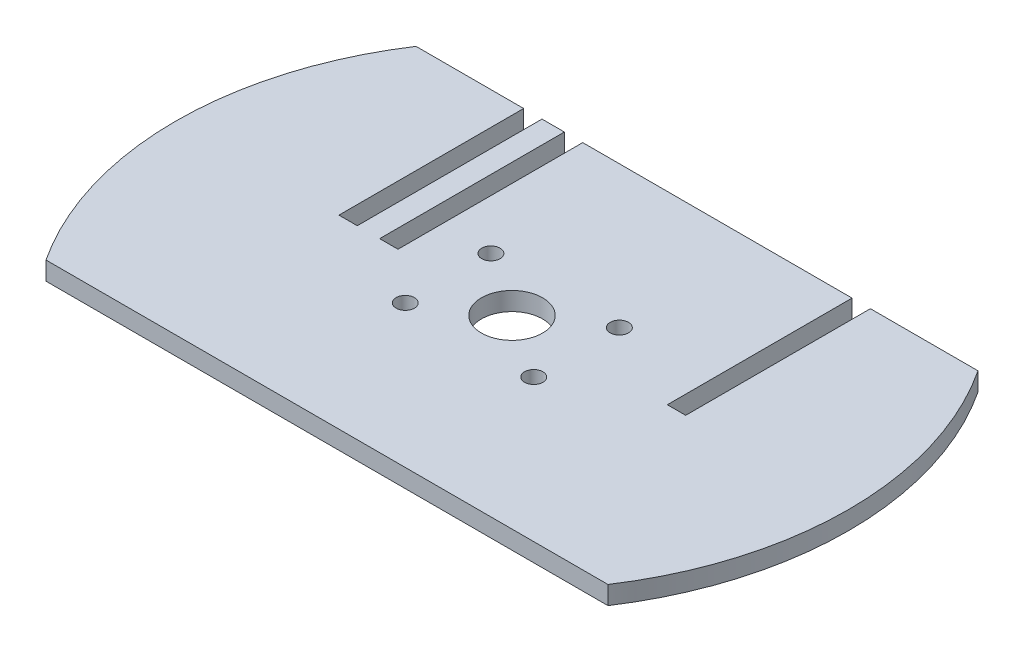
ISO-10303-21;
HEADER;
FILE_DESCRIPTION(('STEP AP214'),'2;1');
FILE_NAME('part.step','',(''),(''),'','','');
FILE_SCHEMA(('AUTOMOTIVE_DESIGN { 1 0 10303 214 1 1 1 1 }'));
ENDSEC;
DATA;
#1=APPLICATION_CONTEXT('core data for automotive mechanical design processes');
#2=APPLICATION_PROTOCOL_DEFINITION('international standard','automotive_design',2000,#1);
#3=PRODUCT_CONTEXT('',#1,'mechanical');
#4=PRODUCT('Part','Part','',(#3));
#5=PRODUCT_RELATED_PRODUCT_CATEGORY('part','',(#4));
#6=PRODUCT_DEFINITION_FORMATION('','',#4);
#7=PRODUCT_DEFINITION_CONTEXT('part definition',#1,'design');
#8=PRODUCT_DEFINITION('design','',#6,#7);
#9=PRODUCT_DEFINITION_SHAPE('','',#8);
#10=(LENGTH_UNIT() NAMED_UNIT(*) SI_UNIT(.MILLI.,.METRE.));
#11=(NAMED_UNIT(*) PLANE_ANGLE_UNIT() SI_UNIT($,.RADIAN.));
#12=(NAMED_UNIT(*) SI_UNIT($,.STERADIAN.) SOLID_ANGLE_UNIT());
#13=UNCERTAINTY_MEASURE_WITH_UNIT(LENGTH_MEASURE(1.E-05),#10,'distance_accuracy_value','');
#14=(GEOMETRIC_REPRESENTATION_CONTEXT(3) GLOBAL_UNCERTAINTY_ASSIGNED_CONTEXT((#13)) GLOBAL_UNIT_ASSIGNED_CONTEXT((#10,
#11,#12)) REPRESENTATION_CONTEXT('',''));
#15=CARTESIAN_POINT('',(0.,0.,0.));
#16=DIRECTION('',(0.,0.,1.));
#17=DIRECTION('',(1.,0.,0.));
#18=AXIS2_PLACEMENT_3D('',#15,#16,#17);
#19=CARTESIAN_POINT('',(-12.45236018043,3.,-3.70299422628653));
#20=DIRECTION('',(0.,0.,-1.));
#21=DIRECTION('',(-1.,0.,0.));
#22=AXIS2_PLACEMENT_3D('',#19,#20,#21);
#23=PLANE('',#22);
#24=DIRECTION('',(0.,1.,0.));
#25=VECTOR('',#24,1.);
#26=CARTESIAN_POINT('',(-15.45236018043,0.,-3.70299422628653));
#27=LINE('',#26,#25);
#28=CARTESIAN_POINT('',(-15.45236018043,0.,-3.70299422628653));
#29=VERTEX_POINT('',#28);
#30=CARTESIAN_POINT('',(-15.45236018043,3.,-3.70299422628653));
#31=VERTEX_POINT('',#30);
#32=EDGE_CURVE('E199',#29,#31,#27,.T.);
#33=ORIENTED_EDGE('',*,*,#32,.F.);
#34=DIRECTION('',(1.,0.,0.));
#35=VECTOR('',#34,1.);
#36=CARTESIAN_POINT('',(-12.45236018043,0.,-3.70299422628653));
#37=LINE('',#36,#35);
#38=CARTESIAN_POINT('',(-19.11236018043,0.,-3.70299422628653));
#39=VERTEX_POINT('',#38);
#40=EDGE_CURVE('E329',#39,#29,#37,.T.);
#41=ORIENTED_EDGE('',*,*,#40,.F.);
#42=DIRECTION('',(0.,-1.,0.));
#43=VECTOR('',#42,1.);
#44=CARTESIAN_POINT('',(-19.11236018043,3.,-3.70299422628653));
#45=LINE('',#44,#43);
#46=CARTESIAN_POINT('',(-19.11236018043,3.,-3.70299422628653));
#47=VERTEX_POINT('',#46);
#48=EDGE_CURVE('E356',#47,#39,#45,.T.);
#49=ORIENTED_EDGE('',*,*,#48,.F.);
#50=DIRECTION('',(1.,0.,0.));
#51=VECTOR('',#50,1.);
#52=CARTESIAN_POINT('',(-19.11236018043,3.,-3.70299422628653));
#53=LINE('',#52,#51);
#54=EDGE_CURVE('E290',#47,#31,#53,.T.);
#55=ORIENTED_EDGE('',*,*,#54,.T.);
#56=EDGE_LOOP('',(#33,#41,#49,#55));
#57=FACE_BOUND('',#56,.T.);
#58=ADVANCED_FACE('F45',(#57),#23,.T.);
#59=CARTESIAN_POINT('',(54.57763981957,3.,56.7970057737135));
#60=DIRECTION('',(0.,0.,1.));
#61=DIRECTION('',(1.,0.,0.));
#62=AXIS2_PLACEMENT_3D('',#59,#60,#61);
#63=PLANE('',#62);
#64=DIRECTION('',(0.,1.,0.));
#65=VECTOR('',#64,1.);
#66=CARTESIAN_POINT('',(-39.7014161737776,0.,56.7970057737135));
#67=LINE('',#66,#65);
#68=CARTESIAN_POINT('',(-39.7014161737776,0.,56.7970057737135));
#69=VERTEX_POINT('',#68);
#70=CARTESIAN_POINT('',(-39.7014161737776,3.,56.7970057737135));
#71=VERTEX_POINT('',#70);
#72=EDGE_CURVE('E211',#69,#71,#67,.T.);
#73=ORIENTED_EDGE('',*,*,#72,.F.);
#74=DIRECTION('',(-1.,0.,0.));
#75=VECTOR('',#74,1.);
#76=CARTESIAN_POINT('',(54.57763981957,0.,56.7970057737135));
#77=LINE('',#76,#75);
#78=CARTESIAN_POINT('',(52.1666958129177,0.,56.7970057737135));
#79=VERTEX_POINT('',#78);
#80=EDGE_CURVE('E265',#79,#69,#77,.T.);
#81=ORIENTED_EDGE('',*,*,#80,.F.);
#82=DIRECTION('',(0.,1.,0.));
#83=VECTOR('',#82,1.);
#84=CARTESIAN_POINT('',(52.1666958129177,0.,56.7970057737135));
#85=LINE('',#84,#83);
#86=CARTESIAN_POINT('',(52.1666958129177,3.,56.7970057737135));
#87=VERTEX_POINT('',#86);
#88=EDGE_CURVE('E217',#79,#87,#85,.T.);
#89=ORIENTED_EDGE('',*,*,#88,.T.);
#90=DIRECTION('',(-1.,0.,0.));
#91=VECTOR('',#90,1.);
#92=CARTESIAN_POINT('',(54.57763981957,3.,56.7970057737135));
#93=LINE('',#92,#91);
#94=EDGE_CURVE('E269',#87,#71,#93,.T.);
#95=ORIENTED_EDGE('',*,*,#94,.T.);
#96=EDGE_LOOP('',(#73,#81,#89,#95));
#97=FACE_BOUND('',#96,.T.);
#98=ADVANCED_FACE('F47',(#97),#63,.T.);
#99=CARTESIAN_POINT('',(34.57763981957,3.,-3.70299422628653));
#100=DIRECTION('',(0.,0.,-1.));
#101=DIRECTION('',(-1.,0.,0.));
#102=AXIS2_PLACEMENT_3D('',#99,#100,#101);
#103=PLANE('',#102);
#104=DIRECTION('',(0.,1.,0.));
#105=VECTOR('',#104,1.);
#106=CARTESIAN_POINT('',(52.1666958129177,0.,-3.70299422628653));
#107=LINE('',#106,#105);
#108=CARTESIAN_POINT('',(52.1666958129177,0.,-3.70299422628653));
#109=VERTEX_POINT('',#108);
#110=CARTESIAN_POINT('',(52.1666958129177,3.,-3.70299422628653));
#111=VERTEX_POINT('',#110);
#112=EDGE_CURVE('E198',#109,#111,#107,.T.);
#113=ORIENTED_EDGE('',*,*,#112,.F.);
#114=DIRECTION('',(1.,0.,0.));
#115=VECTOR('',#114,1.);
#116=CARTESIAN_POINT('',(34.57763981957,0.,-3.70299422628653));
#117=LINE('',#116,#115);
#118=CARTESIAN_POINT('',(34.57763981957,0.,-3.70299422628653));
#119=VERTEX_POINT('',#118);
#120=EDGE_CURVE('E274',#119,#109,#117,.T.);
#121=ORIENTED_EDGE('',*,*,#120,.F.);
#122=DIRECTION('',(0.,-1.,0.));
#123=VECTOR('',#122,1.);
#124=CARTESIAN_POINT('',(34.57763981957,3.,-3.70299422628653));
#125=LINE('',#124,#123);
#126=CARTESIAN_POINT('',(34.57763981957,3.,-3.70299422628653));
#127=VERTEX_POINT('',#126);
#128=EDGE_CURVE('E11',#127,#119,#125,.T.);
#129=ORIENTED_EDGE('',*,*,#128,.F.);
#130=DIRECTION('',(1.,0.,0.));
#131=VECTOR('',#130,1.);
#132=CARTESIAN_POINT('',(34.57763981957,3.,-3.70299422628653));
#133=LINE('',#132,#131);
#134=EDGE_CURVE('E306',#127,#111,#133,.T.);
#135=ORIENTED_EDGE('',*,*,#134,.T.);
#136=EDGE_LOOP('',(#113,#121,#129,#135));
#137=FACE_BOUND('',#136,.T.);
#138=ADVANCED_FACE('F420',(#137),#103,.T.);
#139=CARTESIAN_POINT('',(34.57763981957,3.,26.4970057737135));
#140=DIRECTION('',(-1.,0.,0.));
#141=DIRECTION('',(0.,0.,1.));
#142=AXIS2_PLACEMENT_3D('',#139,#140,#141);
#143=PLANE('',#142);
#144=DIRECTION('',(0.,0.,-1.));
#145=VECTOR('',#144,1.);
#146=CARTESIAN_POINT('',(34.57763981957,0.,26.4970057737135));
#147=LINE('',#146,#145);
#148=CARTESIAN_POINT('',(34.57763981957,0.,26.4970057737135));
#149=VERTEX_POINT('',#148);
#150=EDGE_CURVE('E340',#149,#119,#147,.T.);
#151=ORIENTED_EDGE('',*,*,#150,.F.);
#152=DIRECTION('',(0.,-1.,0.));
#153=VECTOR('',#152,1.);
#154=CARTESIAN_POINT('',(34.57763981957,3.,26.4970057737135));
#155=LINE('',#154,#153);
#156=CARTESIAN_POINT('',(34.57763981957,3.,26.4970057737135));
#157=VERTEX_POINT('',#156);
#158=EDGE_CURVE('E55',#157,#149,#155,.T.);
#159=ORIENTED_EDGE('',*,*,#158,.F.);
#160=DIRECTION('',(0.,0.,-1.));
#161=VECTOR('',#160,1.);
#162=CARTESIAN_POINT('',(34.57763981957,3.,26.4970057737135));
#163=LINE('',#162,#161);
#164=EDGE_CURVE('E302',#157,#127,#163,.T.);
#165=ORIENTED_EDGE('',*,*,#164,.T.);
#166=ORIENTED_EDGE('',*,*,#128,.T.);
#167=EDGE_LOOP('',(#151,#159,#165,#166));
#168=FACE_BOUND('',#167,.T.);
#169=ADVANCED_FACE('F416',(#168),#143,.T.);
#170=CARTESIAN_POINT('',(31.57763981957,3.,26.4970057737135));
#171=DIRECTION('',(0.,0.,-1.));
#172=DIRECTION('',(-1.,0.,0.));
#173=AXIS2_PLACEMENT_3D('',#170,#171,#172);
#174=PLANE('',#173);
#175=DIRECTION('',(1.,0.,0.));
#176=VECTOR('',#175,1.);
#177=CARTESIAN_POINT('',(31.57763981957,0.,26.4970057737135));
#178=LINE('',#177,#176);
#179=CARTESIAN_POINT('',(31.57763981957,0.,26.4970057737135));
#180=VERTEX_POINT('',#179);
#181=EDGE_CURVE('E336',#180,#149,#178,.T.);
#182=ORIENTED_EDGE('',*,*,#181,.F.);
#183=DIRECTION('',(0.,-1.,0.));
#184=VECTOR('',#183,1.);
#185=CARTESIAN_POINT('',(31.57763981957,3.,26.4970057737135));
#186=LINE('',#185,#184);
#187=CARTESIAN_POINT('',(31.57763981957,3.,26.4970057737135));
#188=VERTEX_POINT('',#187);
#189=EDGE_CURVE('E349',#188,#180,#186,.T.);
#190=ORIENTED_EDGE('',*,*,#189,.F.);
#191=DIRECTION('',(1.,0.,0.));
#192=VECTOR('',#191,1.);
#193=CARTESIAN_POINT('',(31.57763981957,3.,26.4970057737135));
#194=LINE('',#193,#192);
#195=EDGE_CURVE('E298',#188,#157,#194,.T.);
#196=ORIENTED_EDGE('',*,*,#195,.T.);
#197=ORIENTED_EDGE('',*,*,#158,.T.);
#198=EDGE_LOOP('',(#182,#190,#196,#197));
#199=FACE_BOUND('',#198,.T.);
#200=ADVANCED_FACE('F412',(#199),#174,.T.);
#201=CARTESIAN_POINT('',(31.57763981957,3.,-3.70299422628653));
#202=DIRECTION('',(1.,0.,0.));
#203=DIRECTION('',(0.,0.,-1.));
#204=AXIS2_PLACEMENT_3D('',#201,#202,#203);
#205=PLANE('',#204);
#206=DIRECTION('',(0.,0.,1.));
#207=VECTOR('',#206,1.);
#208=CARTESIAN_POINT('',(31.57763981957,0.,-3.70299422628653));
#209=LINE('',#208,#207);
#210=CARTESIAN_POINT('',(31.57763981957,0.,-3.70299422628653));
#211=VERTEX_POINT('',#210);
#212=EDGE_CURVE('E332',#211,#180,#209,.T.);
#213=ORIENTED_EDGE('',*,*,#212,.F.);
#214=DIRECTION('',(0.,-1.,0.));
#215=VECTOR('',#214,1.);
#216=CARTESIAN_POINT('',(31.57763981957,3.,-3.70299422628653));
#217=LINE('',#216,#215);
#218=CARTESIAN_POINT('',(31.57763981957,3.,-3.70299422628653));
#219=VERTEX_POINT('',#218);
#220=EDGE_CURVE('E352',#219,#211,#217,.T.);
#221=ORIENTED_EDGE('',*,*,#220,.F.);
#222=DIRECTION('',(0.,0.,1.));
#223=VECTOR('',#222,1.);
#224=CARTESIAN_POINT('',(31.57763981957,3.,-3.70299422628653));
#225=LINE('',#224,#223);
#226=EDGE_CURVE('E294',#219,#188,#225,.T.);
#227=ORIENTED_EDGE('',*,*,#226,.T.);
#228=ORIENTED_EDGE('',*,*,#189,.T.);
#229=EDGE_LOOP('',(#213,#221,#227,#228));
#230=FACE_BOUND('',#229,.T.);
#231=ADVANCED_FACE('F409',(#230),#205,.T.);
#232=DIRECTION('',(0.,1.,0.));
#233=VECTOR('',#232,1.);
#234=CARTESIAN_POINT('',(-12.45236018043,0.,-3.70299422628653));
#235=LINE('',#234,#233);
#236=CARTESIAN_POINT('',(-12.45236018043,0.,-3.70299422628653));
#237=VERTEX_POINT('',#236);
#238=CARTESIAN_POINT('',(-12.45236018043,3.,-3.70299422628653));
#239=VERTEX_POINT('',#238);
#240=EDGE_CURVE('E63',#237,#239,#235,.T.);
#241=ORIENTED_EDGE('',*,*,#240,.T.);
#242=EDGE_CURVE('E289',#239,#219,#53,.T.);
#243=ORIENTED_EDGE('',*,*,#242,.T.);
#244=ORIENTED_EDGE('',*,*,#220,.T.);
#245=EDGE_CURVE('E328',#237,#211,#37,.T.);
#246=ORIENTED_EDGE('',*,*,#245,.F.);
#247=EDGE_LOOP('',(#241,#243,#244,#246));
#248=FACE_BOUND('',#247,.T.);
#249=ADVANCED_FACE('F402',(#248),#23,.T.);
#250=CARTESIAN_POINT('',(-19.11236018043,3.,26.4970057737135));
#251=DIRECTION('',(-1.,0.,0.));
#252=DIRECTION('',(0.,0.,1.));
#253=AXIS2_PLACEMENT_3D('',#250,#251,#252);
#254=PLANE('',#253);
#255=DIRECTION('',(0.,0.,-1.));
#256=VECTOR('',#255,1.);
#257=CARTESIAN_POINT('',(-19.11236018043,0.,26.4970057737135));
#258=LINE('',#257,#256);
#259=CARTESIAN_POINT('',(-19.11236018043,0.,26.4970057737135));
#260=VERTEX_POINT('',#259);
#261=EDGE_CURVE('E324',#260,#39,#258,.T.);
#262=ORIENTED_EDGE('',*,*,#261,.F.);
#263=DIRECTION('',(0.,-1.,0.));
#264=VECTOR('',#263,1.);
#265=CARTESIAN_POINT('',(-19.11236018043,3.,26.4970057737135));
#266=LINE('',#265,#264);
#267=CARTESIAN_POINT('',(-19.11236018043,3.,26.4970057737135));
#268=VERTEX_POINT('',#267);
#269=EDGE_CURVE('E360',#268,#260,#266,.T.);
#270=ORIENTED_EDGE('',*,*,#269,.F.);
#271=DIRECTION('',(0.,0.,-1.));
#272=VECTOR('',#271,1.);
#273=CARTESIAN_POINT('',(-19.11236018043,3.,26.4970057737135));
#274=LINE('',#273,#272);
#275=EDGE_CURVE('E285',#268,#47,#274,.T.);
#276=ORIENTED_EDGE('',*,*,#275,.T.);
#277=ORIENTED_EDGE('',*,*,#48,.T.);
#278=EDGE_LOOP('',(#262,#270,#276,#277));
#279=FACE_BOUND('',#278,.T.);
#280=ADVANCED_FACE('F393',(#279),#254,.T.);
#281=CARTESIAN_POINT('',(-22.11236018043,3.,26.4970057737135));
#282=DIRECTION('',(0.,0.,-1.));
#283=DIRECTION('',(-1.,0.,0.));
#284=AXIS2_PLACEMENT_3D('',#281,#282,#283);
#285=PLANE('',#284);
#286=DIRECTION('',(1.,0.,0.));
#287=VECTOR('',#286,1.);
#288=CARTESIAN_POINT('',(-22.11236018043,0.,26.4970057737135));
#289=LINE('',#288,#287);
#290=CARTESIAN_POINT('',(-22.11236018043,0.,26.4970057737135));
#291=VERTEX_POINT('',#290);
#292=EDGE_CURVE('E320',#291,#260,#289,.T.);
#293=ORIENTED_EDGE('',*,*,#292,.F.);
#294=DIRECTION('',(0.,-1.,0.));
#295=VECTOR('',#294,1.);
#296=CARTESIAN_POINT('',(-22.11236018043,3.,26.4970057737135));
#297=LINE('',#296,#295);
#298=CARTESIAN_POINT('',(-22.11236018043,3.,26.4970057737135));
#299=VERTEX_POINT('',#298);
#300=EDGE_CURVE('E362',#299,#291,#297,.T.);
#301=ORIENTED_EDGE('',*,*,#300,.F.);
#302=DIRECTION('',(1.,0.,0.));
#303=VECTOR('',#302,1.);
#304=CARTESIAN_POINT('',(-22.11236018043,3.,26.4970057737135));
#305=LINE('',#304,#303);
#306=EDGE_CURVE('E281',#299,#268,#305,.T.);
#307=ORIENTED_EDGE('',*,*,#306,.T.);
#308=ORIENTED_EDGE('',*,*,#269,.T.);
#309=EDGE_LOOP('',(#293,#301,#307,#308));
#310=FACE_BOUND('',#309,.T.);
#311=ADVANCED_FACE('F390',(#310),#285,.T.);
#312=CARTESIAN_POINT('',(-22.11236018043,3.,-3.70299422628653));
#313=DIRECTION('',(1.,0.,0.));
#314=DIRECTION('',(0.,0.,-1.));
#315=AXIS2_PLACEMENT_3D('',#312,#313,#314);
#316=PLANE('',#315);
#317=DIRECTION('',(0.,0.,1.));
#318=VECTOR('',#317,1.);
#319=CARTESIAN_POINT('',(-22.11236018043,0.,-3.70299422628653));
#320=LINE('',#319,#318);
#321=CARTESIAN_POINT('',(-22.11236018043,0.,-3.70299422628653));
#322=VERTEX_POINT('',#321);
#323=EDGE_CURVE('E316',#322,#291,#320,.T.);
#324=ORIENTED_EDGE('',*,*,#323,.F.);
#325=DIRECTION('',(0.,-1.,0.));
#326=VECTOR('',#325,1.);
#327=CARTESIAN_POINT('',(-22.11236018043,3.,-3.70299422628653));
#328=LINE('',#327,#326);
#329=CARTESIAN_POINT('',(-22.11236018043,3.,-3.70299422628653));
#330=VERTEX_POINT('',#329);
#331=EDGE_CURVE('E49',#330,#322,#328,.T.);
#332=ORIENTED_EDGE('',*,*,#331,.F.);
#333=DIRECTION('',(0.,0.,1.));
#334=VECTOR('',#333,1.);
#335=CARTESIAN_POINT('',(-22.11236018043,3.,-3.70299422628653));
#336=LINE('',#335,#334);
#337=EDGE_CURVE('E277',#330,#299,#336,.T.);
#338=ORIENTED_EDGE('',*,*,#337,.T.);
#339=ORIENTED_EDGE('',*,*,#300,.T.);
#340=EDGE_LOOP('',(#324,#332,#338,#339));
#341=FACE_BOUND('',#340,.T.);
#342=ADVANCED_FACE('F375',(#341),#316,.T.);
#343=CARTESIAN_POINT('',(-42.11236018043,3.,-3.70299422628653));
#344=DIRECTION('',(0.,0.,-1.));
#345=DIRECTION('',(-1.,0.,0.));
#346=AXIS2_PLACEMENT_3D('',#343,#344,#345);
#347=PLANE('',#346);
#348=DIRECTION('',(0.,1.,0.));
#349=VECTOR('',#348,1.);
#350=CARTESIAN_POINT('',(-39.7014161737776,0.,-3.70299422628653));
#351=LINE('',#350,#349);
#352=CARTESIAN_POINT('',(-39.7014161737776,0.,-3.70299422628653));
#353=VERTEX_POINT('',#352);
#354=CARTESIAN_POINT('',(-39.7014161737776,3.,-3.70299422628653));
#355=VERTEX_POINT('',#354);
#356=EDGE_CURVE('E71',#353,#355,#351,.T.);
#357=ORIENTED_EDGE('',*,*,#356,.T.);
#358=DIRECTION('',(1.,0.,0.));
#359=VECTOR('',#358,1.);
#360=CARTESIAN_POINT('',(-42.11236018043,3.,-3.70299422628653));
#361=LINE('',#360,#359);
#362=EDGE_CURVE('E273',#355,#330,#361,.T.);
#363=ORIENTED_EDGE('',*,*,#362,.T.);
#364=ORIENTED_EDGE('',*,*,#331,.T.);
#365=DIRECTION('',(1.,0.,0.));
#366=VECTOR('',#365,1.);
#367=CARTESIAN_POINT('',(-42.11236018043,0.,-3.70299422628653));
#368=LINE('',#367,#366);
#369=EDGE_CURVE('E313',#353,#322,#368,.T.);
#370=ORIENTED_EDGE('',*,*,#369,.F.);
#371=EDGE_LOOP('',(#357,#363,#364,#370));
#372=FACE_BOUND('',#371,.T.);
#373=ADVANCED_FACE('F372',(#372),#347,.T.);
#374=CARTESIAN_POINT('',(-42.11236018043,3.,46.7970057737135));
#375=DIRECTION('',(0.,-1.,0.));
#376=DIRECTION('',(0.,0.,-1.));
#377=AXIS2_PLACEMENT_3D('',#374,#375,#376);
#378=PLANE('',#377);
#379=CARTESIAN_POINT('',(-4.26736018042996,3.,33.4970057737135));
#380=DIRECTION('',(0.,1.,0.));
#381=DIRECTION('',(0.,0.,1.));
#382=AXIS2_PLACEMENT_3D('',#379,#380,#381);
#383=CIRCLE('',#382,1.5);
#384=CARTESIAN_POINT('',(-4.26736018042996,3.,34.9970057737135));
#385=VERTEX_POINT('',#384);
#386=EDGE_CURVE('E237',#385,#385,#383,.T.);
#387=ORIENTED_EDGE('',*,*,#386,.F.);
#388=EDGE_LOOP('',(#387));
#389=FACE_BOUND('',#388,.T.);
#390=CARTESIAN_POINT('',(16.73263981957,3.,19.4970057737135));
#391=DIRECTION('',(0.,1.,0.));
#392=DIRECTION('',(0.,0.,1.));
#393=AXIS2_PLACEMENT_3D('',#390,#391,#392);
#394=CIRCLE('',#393,1.5);
#395=CARTESIAN_POINT('',(16.73263981957,3.,20.9970057737135));
#396=VERTEX_POINT('',#395);
#397=EDGE_CURVE('E246',#396,#396,#394,.T.);
#398=ORIENTED_EDGE('',*,*,#397,.F.);
#399=EDGE_LOOP('',(#398));
#400=FACE_BOUND('',#399,.T.);
#401=CARTESIAN_POINT('',(16.73263981957,3.,33.4970057737135));
#402=DIRECTION('',(0.,1.,0.));
#403=DIRECTION('',(0.,0.,1.));
#404=AXIS2_PLACEMENT_3D('',#401,#402,#403);
#405=CIRCLE('',#404,1.5);
#406=CARTESIAN_POINT('',(16.73263981957,3.,34.9970057737135));
#407=VERTEX_POINT('',#406);
#408=EDGE_CURVE('E229',#407,#407,#405,.T.);
#409=ORIENTED_EDGE('',*,*,#408,.F.);
#410=EDGE_LOOP('',(#409));
#411=FACE_BOUND('',#410,.T.);
#412=CARTESIAN_POINT('',(-4.26736018042996,3.,19.4970057737135));
#413=DIRECTION('',(0.,1.,0.));
#414=DIRECTION('',(0.,0.,1.));
#415=AXIS2_PLACEMENT_3D('',#412,#413,#414);
#416=CIRCLE('',#415,1.5);
#417=CARTESIAN_POINT('',(-4.26736018042996,3.,20.9970057737135));
#418=VERTEX_POINT('',#417);
#419=EDGE_CURVE('E241',#418,#418,#416,.T.);
#420=ORIENTED_EDGE('',*,*,#419,.F.);
#421=EDGE_LOOP('',(#420));
#422=FACE_BOUND('',#421,.T.);
#423=CARTESIAN_POINT('',(6.23263981957004,3.,26.5470057737135));
#424=DIRECTION('',(0.,1.,0.));
#425=DIRECTION('',(0.,0.,1.));
#426=AXIS2_PLACEMENT_3D('',#423,#424,#425);
#427=CIRCLE('',#426,5.);
#428=CARTESIAN_POINT('',(6.23263981957004,3.,31.5470057737135));
#429=VERTEX_POINT('',#428);
#430=EDGE_CURVE('E257',#429,#429,#427,.T.);
#431=ORIENTED_EDGE('',*,*,#430,.F.);
#432=EDGE_LOOP('',(#431));
#433=FACE_BOUND('',#432,.T.);
#434=DIRECTION('',(1.,0.,0.));
#435=VECTOR('',#434,1.);
#436=CARTESIAN_POINT('',(-12.45236018043,3.,26.4970057737135));
#437=LINE('',#436,#435);
#438=CARTESIAN_POINT('',(-15.45236018043,3.,26.4970057737135));
#439=VERTEX_POINT('',#438);
#440=CARTESIAN_POINT('',(-12.45236018043,3.,26.4970057737135));
#441=VERTEX_POINT('',#440);
#442=EDGE_CURVE('E167',#439,#441,#437,.T.);
#443=ORIENTED_EDGE('',*,*,#442,.F.);
#444=DIRECTION('',(0.,0.,1.));
#445=VECTOR('',#444,1.);
#446=CARTESIAN_POINT('',(-15.45236018043,3.,26.4970057737135));
#447=LINE('',#446,#445);
#448=EDGE_CURVE('E182',#31,#439,#447,.T.);
#449=ORIENTED_EDGE('',*,*,#448,.F.);
#450=ORIENTED_EDGE('',*,*,#54,.F.);
#451=ORIENTED_EDGE('',*,*,#275,.F.);
#452=ORIENTED_EDGE('',*,*,#306,.F.);
#453=ORIENTED_EDGE('',*,*,#337,.F.);
#454=ORIENTED_EDGE('',*,*,#362,.F.);
#455=CARTESIAN_POINT('',(6.23263981957004,3.,26.5470057737135));
#456=DIRECTION('',(0.,-1.,0.));
#457=DIRECTION('',(0.,0.,-1.));
#458=AXIS2_PLACEMENT_3D('',#455,#456,#457);
#459=CIRCLE('',#458,55.);
#460=EDGE_CURVE('E207',#71,#355,#459,.T.);
#461=ORIENTED_EDGE('',*,*,#460,.F.);
#462=ORIENTED_EDGE('',*,*,#94,.F.);
#463=CARTESIAN_POINT('',(6.23263981957004,3.,26.5470057737135));
#464=DIRECTION('',(0.,-1.,0.));
#465=DIRECTION('',(0.,0.,-1.));
#466=AXIS2_PLACEMENT_3D('',#463,#464,#465);
#467=CIRCLE('',#466,55.);
#468=EDGE_CURVE('E210',#111,#87,#467,.T.);
#469=ORIENTED_EDGE('',*,*,#468,.F.);
#470=ORIENTED_EDGE('',*,*,#134,.F.);
#471=ORIENTED_EDGE('',*,*,#164,.F.);
#472=ORIENTED_EDGE('',*,*,#195,.F.);
#473=ORIENTED_EDGE('',*,*,#226,.F.);
#474=ORIENTED_EDGE('',*,*,#242,.F.);
#475=DIRECTION('',(0.,0.,-1.));
#476=VECTOR('',#475,1.);
#477=CARTESIAN_POINT('',(-12.45236018043,3.,-3.70299422628653));
#478=LINE('',#477,#476);
#479=EDGE_CURVE('E186',#441,#239,#478,.T.);
#480=ORIENTED_EDGE('',*,*,#479,.F.);
#481=EDGE_LOOP('',(#443,#449,#450,#451,#452,#453,#454,#461,#462,#469,#470,#471,#472,#473,#474,#480));
#482=FACE_BOUND('',#481,.T.);
#483=ADVANCED_FACE('F384',(#389,#400,#411,#422,#433,#482),#378,.F.);
#484=CARTESIAN_POINT('',(-42.11236018043,0.,46.7970057737135));
#485=DIRECTION('',(0.,-1.,0.));
#486=DIRECTION('',(0.,0.,-1.));
#487=AXIS2_PLACEMENT_3D('',#484,#485,#486);
#488=PLANE('',#487);
#489=DIRECTION('',(0.,0.,1.));
#490=VECTOR('',#489,1.);
#491=CARTESIAN_POINT('',(-15.45236018043,0.,26.4970057737135));
#492=LINE('',#491,#490);
#493=CARTESIAN_POINT('',(-15.45236018043,0.,26.4970057737135));
#494=VERTEX_POINT('',#493);
#495=EDGE_CURVE('E170',#29,#494,#492,.T.);
#496=ORIENTED_EDGE('',*,*,#495,.T.);
#497=DIRECTION('',(1.,0.,0.));
#498=VECTOR('',#497,1.);
#499=CARTESIAN_POINT('',(-12.45236018043,0.,26.4970057737135));
#500=LINE('',#499,#498);
#501=CARTESIAN_POINT('',(-12.45236018043,0.,26.4970057737135));
#502=VERTEX_POINT('',#501);
#503=EDGE_CURVE('E164',#494,#502,#500,.T.);
#504=ORIENTED_EDGE('',*,*,#503,.T.);
#505=DIRECTION('',(0.,0.,-1.));
#506=VECTOR('',#505,1.);
#507=CARTESIAN_POINT('',(-12.45236018043,0.,-3.70299422628653));
#508=LINE('',#507,#506);
#509=EDGE_CURVE('E172',#502,#237,#508,.T.);
#510=ORIENTED_EDGE('',*,*,#509,.T.);
#511=ORIENTED_EDGE('',*,*,#245,.T.);
#512=ORIENTED_EDGE('',*,*,#212,.T.);
#513=ORIENTED_EDGE('',*,*,#181,.T.);
#514=ORIENTED_EDGE('',*,*,#150,.T.);
#515=ORIENTED_EDGE('',*,*,#120,.T.);
#516=CARTESIAN_POINT('',(6.23263981957004,0.,26.5470057737135));
#517=DIRECTION('',(0.,-1.,0.));
#518=DIRECTION('',(0.,0.,-1.));
#519=AXIS2_PLACEMENT_3D('',#516,#517,#518);
#520=CIRCLE('',#519,55.);
#521=EDGE_CURVE('E221',#109,#79,#520,.T.);
#522=ORIENTED_EDGE('',*,*,#521,.T.);
#523=ORIENTED_EDGE('',*,*,#80,.T.);
#524=CARTESIAN_POINT('',(6.23263981957004,0.,26.5470057737135));
#525=DIRECTION('',(0.,-1.,0.));
#526=DIRECTION('',(0.,0.,-1.));
#527=AXIS2_PLACEMENT_3D('',#524,#525,#526);
#528=CIRCLE('',#527,55.);
#529=EDGE_CURVE('E204',#69,#353,#528,.T.);
#530=ORIENTED_EDGE('',*,*,#529,.T.);
#531=ORIENTED_EDGE('',*,*,#369,.T.);
#532=ORIENTED_EDGE('',*,*,#323,.T.);
#533=ORIENTED_EDGE('',*,*,#292,.T.);
#534=ORIENTED_EDGE('',*,*,#261,.T.);
#535=ORIENTED_EDGE('',*,*,#40,.T.);
#536=EDGE_LOOP('',(#496,#504,#510,#511,#512,#513,#514,#515,#522,#523,#530,#531,#532,#533,#534,#535));
#537=FACE_BOUND('',#536,.T.);
#538=CARTESIAN_POINT('',(-4.26736018042996,0.,33.4970057737135));
#539=DIRECTION('',(0.,1.,0.));
#540=DIRECTION('',(0.,0.,1.));
#541=AXIS2_PLACEMENT_3D('',#538,#539,#540);
#542=CIRCLE('',#541,1.5);
#543=CARTESIAN_POINT('',(-4.26736018042996,0.,34.9970057737135));
#544=VERTEX_POINT('',#543);
#545=EDGE_CURVE('E242',#544,#544,#542,.T.);
#546=ORIENTED_EDGE('',*,*,#545,.T.);
#547=EDGE_LOOP('',(#546));
#548=FACE_BOUND('',#547,.T.);
#549=CARTESIAN_POINT('',(16.73263981957,0.,19.4970057737135));
#550=DIRECTION('',(0.,1.,0.));
#551=DIRECTION('',(0.,0.,1.));
#552=AXIS2_PLACEMENT_3D('',#549,#550,#551);
#553=CIRCLE('',#552,1.5);
#554=CARTESIAN_POINT('',(16.73263981957,0.,20.9970057737135));
#555=VERTEX_POINT('',#554);
#556=EDGE_CURVE('E233',#555,#555,#553,.T.);
#557=ORIENTED_EDGE('',*,*,#556,.T.);
#558=EDGE_LOOP('',(#557));
#559=FACE_BOUND('',#558,.T.);
#560=CARTESIAN_POINT('',(16.73263981957,0.,33.4970057737135));
#561=DIRECTION('',(0.,1.,0.));
#562=DIRECTION('',(0.,0.,1.));
#563=AXIS2_PLACEMENT_3D('',#560,#561,#562);
#564=CIRCLE('',#563,1.5);
#565=CARTESIAN_POINT('',(16.73263981957,0.,34.9970057737135));
#566=VERTEX_POINT('',#565);
#567=EDGE_CURVE('E214',#566,#566,#564,.T.);
#568=ORIENTED_EDGE('',*,*,#567,.T.);
#569=EDGE_LOOP('',(#568));
#570=FACE_BOUND('',#569,.T.);
#571=CARTESIAN_POINT('',(-4.26736018042996,0.,19.4970057737135));
#572=DIRECTION('',(0.,1.,0.));
#573=DIRECTION('',(0.,0.,1.));
#574=AXIS2_PLACEMENT_3D('',#571,#572,#573);
#575=CIRCLE('',#574,1.5);
#576=CARTESIAN_POINT('',(-4.26736018042996,0.,20.9970057737135));
#577=VERTEX_POINT('',#576);
#578=EDGE_CURVE('E253',#577,#577,#575,.T.);
#579=ORIENTED_EDGE('',*,*,#578,.T.);
#580=EDGE_LOOP('',(#579));
#581=FACE_BOUND('',#580,.T.);
#582=CARTESIAN_POINT('',(6.23263981957004,0.,26.5470057737135));
#583=DIRECTION('',(0.,1.,0.));
#584=DIRECTION('',(0.,0.,1.));
#585=AXIS2_PLACEMENT_3D('',#582,#583,#584);
#586=CIRCLE('',#585,5.);
#587=CARTESIAN_POINT('',(6.23263981957004,0.,31.5470057737135));
#588=VERTEX_POINT('',#587);
#589=EDGE_CURVE('E261',#588,#588,#586,.T.);
#590=ORIENTED_EDGE('',*,*,#589,.T.);
#591=EDGE_LOOP('',(#590));
#592=FACE_BOUND('',#591,.T.);
#593=ADVANCED_FACE('F178',(#537,#548,#559,#570,#581,#592),#488,.T.);
#594=CARTESIAN_POINT('',(6.23263981957004,0.,26.5470057737135));
#595=DIRECTION('',(0.,1.,0.));
#596=DIRECTION('',(0.,0.,1.));
#597=AXIS2_PLACEMENT_3D('',#594,#595,#596);
#598=CYLINDRICAL_SURFACE('',#597,5.);
#599=ORIENTED_EDGE('',*,*,#589,.F.);
#600=EDGE_LOOP('',(#599));
#601=FACE_BOUND('',#600,.T.);
#602=ORIENTED_EDGE('',*,*,#430,.T.);
#603=EDGE_LOOP('',(#602));
#604=FACE_BOUND('',#603,.T.);
#605=ADVANCED_FACE('F460',(#601,#604),#598,.F.);
#606=CARTESIAN_POINT('',(-4.26736018042996,0.,19.4970057737135));
#607=DIRECTION('',(0.,1.,0.));
#608=DIRECTION('',(0.,0.,1.));
#609=AXIS2_PLACEMENT_3D('',#606,#607,#608);
#610=CYLINDRICAL_SURFACE('',#609,1.5);
#611=ORIENTED_EDGE('',*,*,#578,.F.);
#612=EDGE_LOOP('',(#611));
#613=FACE_BOUND('',#612,.T.);
#614=ORIENTED_EDGE('',*,*,#419,.T.);
#615=EDGE_LOOP('',(#614));
#616=FACE_BOUND('',#615,.T.);
#617=ADVANCED_FACE('F465',(#613,#616),#610,.F.);
#618=CARTESIAN_POINT('',(16.73263981957,0.,33.4970057737135));
#619=DIRECTION('',(0.,1.,0.));
#620=DIRECTION('',(0.,0.,1.));
#621=AXIS2_PLACEMENT_3D('',#618,#619,#620);
#622=CYLINDRICAL_SURFACE('',#621,1.5);
#623=ORIENTED_EDGE('',*,*,#567,.F.);
#624=EDGE_LOOP('',(#623));
#625=FACE_BOUND('',#624,.T.);
#626=ORIENTED_EDGE('',*,*,#408,.T.);
#627=EDGE_LOOP('',(#626));
#628=FACE_BOUND('',#627,.T.);
#629=ADVANCED_FACE('F469',(#625,#628),#622,.F.);
#630=CARTESIAN_POINT('',(16.73263981957,0.,19.4970057737135));
#631=DIRECTION('',(0.,1.,0.));
#632=DIRECTION('',(0.,0.,1.));
#633=AXIS2_PLACEMENT_3D('',#630,#631,#632);
#634=CYLINDRICAL_SURFACE('',#633,1.5);
#635=ORIENTED_EDGE('',*,*,#556,.F.);
#636=EDGE_LOOP('',(#635));
#637=FACE_BOUND('',#636,.T.);
#638=ORIENTED_EDGE('',*,*,#397,.T.);
#639=EDGE_LOOP('',(#638));
#640=FACE_BOUND('',#639,.T.);
#641=ADVANCED_FACE('F432',(#637,#640),#634,.F.);
#642=CARTESIAN_POINT('',(-4.26736018042996,0.,33.4970057737135));
#643=DIRECTION('',(0.,1.,0.));
#644=DIRECTION('',(0.,0.,1.));
#645=AXIS2_PLACEMENT_3D('',#642,#643,#644);
#646=CYLINDRICAL_SURFACE('',#645,1.5);
#647=ORIENTED_EDGE('',*,*,#545,.F.);
#648=EDGE_LOOP('',(#647));
#649=FACE_BOUND('',#648,.T.);
#650=ORIENTED_EDGE('',*,*,#386,.T.);
#651=EDGE_LOOP('',(#650));
#652=FACE_BOUND('',#651,.T.);
#653=ADVANCED_FACE('F424',(#649,#652),#646,.F.);
#654=CARTESIAN_POINT('',(6.23263981957004,0.,26.5470057737135));
#655=DIRECTION('',(0.,1.,0.));
#656=DIRECTION('',(0.,0.,1.));
#657=AXIS2_PLACEMENT_3D('',#654,#655,#656);
#658=CYLINDRICAL_SURFACE('',#657,55.);
#659=ORIENTED_EDGE('',*,*,#468,.T.);
#660=ORIENTED_EDGE('',*,*,#88,.F.);
#661=ORIENTED_EDGE('',*,*,#521,.F.);
#662=ORIENTED_EDGE('',*,*,#112,.T.);
#663=EDGE_LOOP('',(#659,#660,#661,#662));
#664=FACE_BOUND('',#663,.T.);
#665=ADVANCED_FACE('F422',(#664),#658,.T.);
#666=CARTESIAN_POINT('',(6.23263981957004,0.,26.5470057737135));
#667=DIRECTION('',(0.,1.,0.));
#668=DIRECTION('',(0.,0.,1.));
#669=AXIS2_PLACEMENT_3D('',#666,#667,#668);
#670=CYLINDRICAL_SURFACE('',#669,55.);
#671=ORIENTED_EDGE('',*,*,#460,.T.);
#672=ORIENTED_EDGE('',*,*,#356,.F.);
#673=ORIENTED_EDGE('',*,*,#529,.F.);
#674=ORIENTED_EDGE('',*,*,#72,.T.);
#675=EDGE_LOOP('',(#671,#672,#673,#674));
#676=FACE_BOUND('',#675,.T.);
#677=ADVANCED_FACE('F378',(#676),#670,.T.);
#678=CARTESIAN_POINT('',(-12.45236018043,0.,26.4970057737135));
#679=DIRECTION('',(0.,0.,1.));
#680=DIRECTION('',(1.,0.,0.));
#681=AXIS2_PLACEMENT_3D('',#678,#679,#680);
#682=PLANE('',#681);
#683=ORIENTED_EDGE('',*,*,#442,.T.);
#684=DIRECTION('',(0.,1.,0.));
#685=VECTOR('',#684,1.);
#686=CARTESIAN_POINT('',(-12.45236018043,0.,26.4970057737135));
#687=LINE('',#686,#685);
#688=EDGE_CURVE('E161',#502,#441,#687,.T.);
#689=ORIENTED_EDGE('',*,*,#688,.F.);
#690=ORIENTED_EDGE('',*,*,#503,.F.);
#691=DIRECTION('',(0.,1.,0.));
#692=VECTOR('',#691,1.);
#693=CARTESIAN_POINT('',(-15.45236018043,0.,26.4970057737135));
#694=LINE('',#693,#692);
#695=EDGE_CURVE('E195',#494,#439,#694,.T.);
#696=ORIENTED_EDGE('',*,*,#695,.T.);
#697=EDGE_LOOP('',(#683,#689,#690,#696));
#698=FACE_BOUND('',#697,.T.);
#699=ADVANCED_FACE('F162',(#698),#682,.F.);
#700=CARTESIAN_POINT('',(-15.45236018043,0.,26.4970057737135));
#701=DIRECTION('',(-1.,0.,0.));
#702=DIRECTION('',(0.,0.,1.));
#703=AXIS2_PLACEMENT_3D('',#700,#701,#702);
#704=PLANE('',#703);
#705=ORIENTED_EDGE('',*,*,#448,.T.);
#706=ORIENTED_EDGE('',*,*,#695,.F.);
#707=ORIENTED_EDGE('',*,*,#495,.F.);
#708=ORIENTED_EDGE('',*,*,#32,.T.);
#709=EDGE_LOOP('',(#705,#706,#707,#708));
#710=FACE_BOUND('',#709,.T.);
#711=ADVANCED_FACE('F398',(#710),#704,.F.);
#712=CARTESIAN_POINT('',(-12.45236018043,0.,-3.70299422628653));
#713=DIRECTION('',(1.,0.,0.));
#714=DIRECTION('',(0.,0.,-1.));
#715=AXIS2_PLACEMENT_3D('',#712,#713,#714);
#716=PLANE('',#715);
#717=ORIENTED_EDGE('',*,*,#479,.T.);
#718=ORIENTED_EDGE('',*,*,#240,.F.);
#719=ORIENTED_EDGE('',*,*,#509,.F.);
#720=ORIENTED_EDGE('',*,*,#688,.T.);
#721=EDGE_LOOP('',(#717,#718,#719,#720));
#722=FACE_BOUND('',#721,.T.);
#723=ADVANCED_FACE('F173',(#722),#716,.F.);
#724=CLOSED_SHELL('',(#58,#98,#138,#169,#200,#231,#249,#280,#311,#342,#373,#483,#593,#605,#617,
#629,#641,#653,#665,#677,#699,#711,#723));
#725=MANIFOLD_SOLID_BREP('B2',#724);
#726=ADVANCED_BREP_SHAPE_REPRESENTATION('',(#18,#725),#14);
#727=SHAPE_DEFINITION_REPRESENTATION(#9,#726);
ENDSEC;
END-ISO-10303-21;
